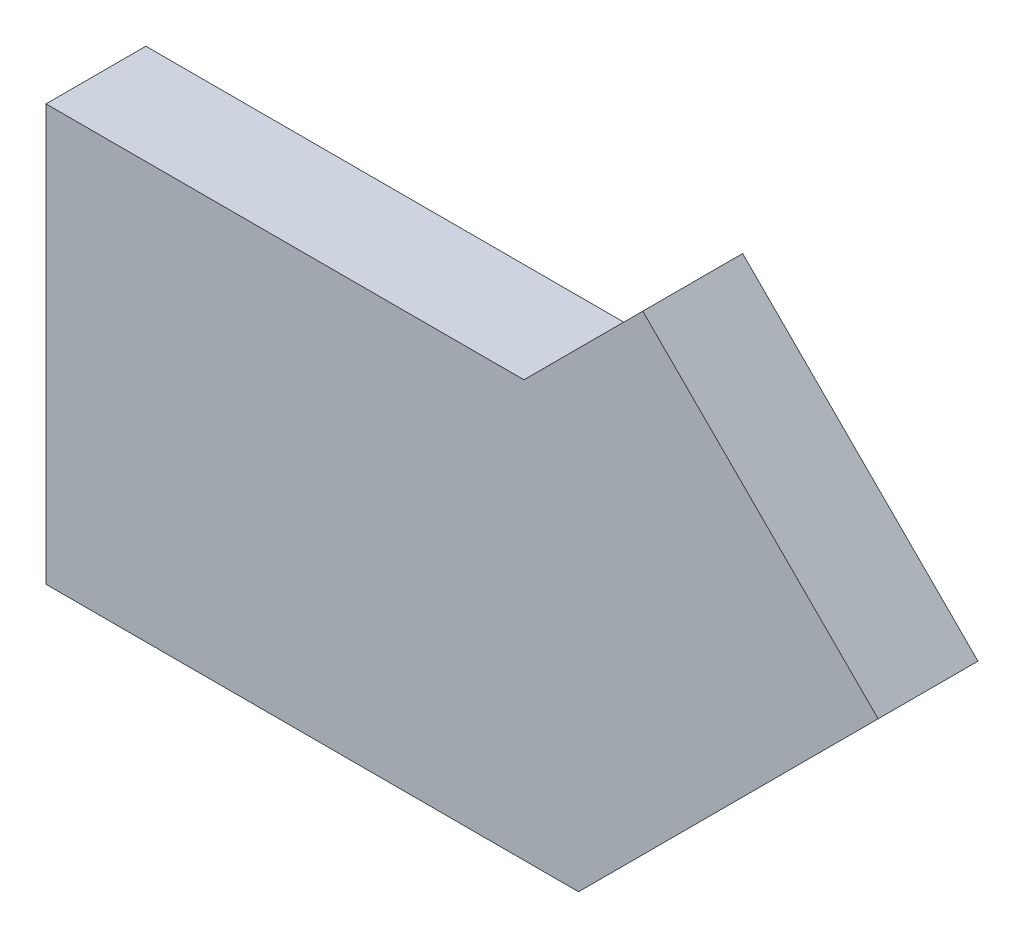
ISO-10303-21;
HEADER;
FILE_DESCRIPTION(('STEP AP214'),'2;1');
FILE_NAME('part.step','',(''),(''),'','','');
FILE_SCHEMA(('AUTOMOTIVE_DESIGN { 1 0 10303 214 1 1 1 1 }'));
ENDSEC;
DATA;
#1=APPLICATION_CONTEXT('core data for automotive mechanical design processes');
#2=APPLICATION_PROTOCOL_DEFINITION('international standard','automotive_design',2000,#1);
#3=PRODUCT_CONTEXT('',#1,'mechanical');
#4=PRODUCT('Part','Part','',(#3));
#5=PRODUCT_RELATED_PRODUCT_CATEGORY('part','',(#4));
#6=PRODUCT_DEFINITION_FORMATION('','',#4);
#7=PRODUCT_DEFINITION_CONTEXT('part definition',#1,'design');
#8=PRODUCT_DEFINITION('design','',#6,#7);
#9=PRODUCT_DEFINITION_SHAPE('','',#8);
#10=(LENGTH_UNIT() NAMED_UNIT(*) SI_UNIT(.MILLI.,.METRE.));
#11=(NAMED_UNIT(*) PLANE_ANGLE_UNIT() SI_UNIT($,.RADIAN.));
#12=(NAMED_UNIT(*) SI_UNIT($,.STERADIAN.) SOLID_ANGLE_UNIT());
#13=UNCERTAINTY_MEASURE_WITH_UNIT(LENGTH_MEASURE(1.E-05),#10,'distance_accuracy_value','');
#14=(GEOMETRIC_REPRESENTATION_CONTEXT(3) GLOBAL_UNCERTAINTY_ASSIGNED_CONTEXT((#13)) GLOBAL_UNIT_ASSIGNED_CONTEXT((#10,
#11,#12)) REPRESENTATION_CONTEXT('',''));
#15=CARTESIAN_POINT('',(0.,0.,0.));
#16=DIRECTION('',(0.,0.,1.));
#17=DIRECTION('',(1.,0.,0.));
#18=AXIS2_PLACEMENT_3D('',#15,#16,#17);
#19=CARTESIAN_POINT('',(0.,25.,6.));
#20=DIRECTION('',(1.,0.,0.));
#21=DIRECTION('',(0.,0.,-1.));
#22=AXIS2_PLACEMENT_3D('',#19,#20,#21);
#23=PLANE('',#22);
#24=DIRECTION('',(0.,-1.,0.));
#25=VECTOR('',#24,1.);
#26=CARTESIAN_POINT('',(0.,25.,0.));
#27=LINE('',#26,#25);
#28=CARTESIAN_POINT('',(0.,25.,0.));
#29=VERTEX_POINT('',#28);
#30=CARTESIAN_POINT('',(0.,0.,0.));
#31=VERTEX_POINT('',#30);
#32=EDGE_CURVE('E116',#29,#31,#27,.T.);
#33=ORIENTED_EDGE('',*,*,#32,.T.);
#34=DIRECTION('',(0.,0.,-1.));
#35=VECTOR('',#34,1.);
#36=CARTESIAN_POINT('',(0.,0.,6.));
#37=LINE('',#36,#35);
#38=CARTESIAN_POINT('',(0.,0.,6.));
#39=VERTEX_POINT('',#38);
#40=EDGE_CURVE('E11',#39,#31,#37,.T.);
#41=ORIENTED_EDGE('',*,*,#40,.F.);
#42=DIRECTION('',(0.,-1.,0.));
#43=VECTOR('',#42,1.);
#44=CARTESIAN_POINT('',(0.,25.,6.));
#45=LINE('',#44,#43);
#46=CARTESIAN_POINT('',(0.,25.,6.));
#47=VERTEX_POINT('',#46);
#48=EDGE_CURVE('E126',#47,#39,#45,.T.);
#49=ORIENTED_EDGE('',*,*,#48,.F.);
#50=DIRECTION('',(0.,0.,-1.));
#51=VECTOR('',#50,1.);
#52=CARTESIAN_POINT('',(0.,25.,6.));
#53=LINE('',#52,#51);
#54=EDGE_CURVE('E112',#47,#29,#53,.T.);
#55=ORIENTED_EDGE('',*,*,#54,.T.);
#56=EDGE_LOOP('',(#33,#41,#49,#55));
#57=FACE_BOUND('',#56,.T.);
#58=ADVANCED_FACE('F32',(#57),#23,.F.);
#59=CARTESIAN_POINT('',(0.,0.,6.));
#60=DIRECTION('',(0.,1.,0.));
#61=DIRECTION('',(0.,0.,1.));
#62=AXIS2_PLACEMENT_3D('',#59,#60,#61);
#63=PLANE('',#62);
#64=DIRECTION('',(1.,0.,0.));
#65=VECTOR('',#64,1.);
#66=CARTESIAN_POINT('',(0.,0.,0.));
#67=LINE('',#66,#65);
#68=CARTESIAN_POINT('',(32.,0.,0.));
#69=VERTEX_POINT('',#68);
#70=EDGE_CURVE('E119',#31,#69,#67,.T.);
#71=ORIENTED_EDGE('',*,*,#70,.T.);
#72=DIRECTION('',(0.,0.,-1.));
#73=VECTOR('',#72,1.);
#74=CARTESIAN_POINT('',(32.,0.,6.));
#75=LINE('',#74,#73);
#76=CARTESIAN_POINT('',(32.,0.,6.));
#77=VERTEX_POINT('',#76);
#78=EDGE_CURVE('E40',#77,#69,#75,.T.);
#79=ORIENTED_EDGE('',*,*,#78,.F.);
#80=DIRECTION('',(1.,0.,0.));
#81=VECTOR('',#80,1.);
#82=CARTESIAN_POINT('',(0.,0.,6.));
#83=LINE('',#82,#81);
#84=EDGE_CURVE('E85',#39,#77,#83,.T.);
#85=ORIENTED_EDGE('',*,*,#84,.F.);
#86=ORIENTED_EDGE('',*,*,#40,.T.);
#87=EDGE_LOOP('',(#71,#79,#85,#86));
#88=FACE_BOUND('',#87,.T.);
#89=ADVANCED_FACE('F150',(#88),#63,.F.);
#90=CARTESIAN_POINT('',(32.,0.,6.));
#91=DIRECTION('',(-0.707106781186553,0.707106781186542,0.));
#92=DIRECTION('',(-0.707106781186542,-0.707106781186553,0.));
#93=AXIS2_PLACEMENT_3D('',#90,#91,#92);
#94=PLANE('',#93);
#95=DIRECTION('',(0.707106781186542,0.707106781186553,0.));
#96=VECTOR('',#95,1.);
#97=CARTESIAN_POINT('',(32.,0.,0.));
#98=LINE('',#97,#96);
#99=CARTESIAN_POINT('',(50.,18.0000000000003,0.));
#100=VERTEX_POINT('',#99);
#101=EDGE_CURVE('E121',#69,#100,#98,.T.);
#102=ORIENTED_EDGE('',*,*,#101,.T.);
#103=DIRECTION('',(0.,0.,-1.));
#104=VECTOR('',#103,1.);
#105=CARTESIAN_POINT('',(50.,18.0000000000003,6.));
#106=LINE('',#105,#104);
#107=CARTESIAN_POINT('',(50.,18.0000000000003,6.));
#108=VERTEX_POINT('',#107);
#109=EDGE_CURVE('E107',#108,#100,#106,.T.);
#110=ORIENTED_EDGE('',*,*,#109,.F.);
#111=DIRECTION('',(0.707106781186542,0.707106781186553,0.));
#112=VECTOR('',#111,1.);
#113=CARTESIAN_POINT('',(32.,0.,6.));
#114=LINE('',#113,#112);
#115=EDGE_CURVE('E98',#77,#108,#114,.T.);
#116=ORIENTED_EDGE('',*,*,#115,.F.);
#117=ORIENTED_EDGE('',*,*,#78,.T.);
#118=EDGE_LOOP('',(#102,#110,#116,#117));
#119=FACE_BOUND('',#118,.T.);
#120=ADVANCED_FACE('F132',(#119),#94,.F.);
#121=CARTESIAN_POINT('',(50.,18.0000000000003,6.));
#122=DIRECTION('',(-0.707106781186542,-0.707106781186553,0.));
#123=DIRECTION('',(0.707106781186553,-0.707106781186542,0.));
#124=AXIS2_PLACEMENT_3D('',#121,#122,#123);
#125=PLANE('',#124);
#126=DIRECTION('',(-0.707106781186553,0.707106781186542,0.));
#127=VECTOR('',#126,1.);
#128=CARTESIAN_POINT('',(50.,18.0000000000003,0.));
#129=LINE('',#128,#127);
#130=CARTESIAN_POINT('',(35.8578643762689,32.1421356237311,0.));
#131=VERTEX_POINT('',#130);
#132=EDGE_CURVE('E106',#100,#131,#129,.T.);
#133=ORIENTED_EDGE('',*,*,#132,.T.);
#134=DIRECTION('',(0.,0.,-1.));
#135=VECTOR('',#134,1.);
#136=CARTESIAN_POINT('',(35.8578643762689,32.1421356237311,6.));
#137=LINE('',#136,#135);
#138=CARTESIAN_POINT('',(35.8578643762689,32.1421356237311,6.));
#139=VERTEX_POINT('',#138);
#140=EDGE_CURVE('E103',#139,#131,#137,.T.);
#141=ORIENTED_EDGE('',*,*,#140,.F.);
#142=DIRECTION('',(-0.707106781186553,0.707106781186542,0.));
#143=VECTOR('',#142,1.);
#144=CARTESIAN_POINT('',(50.,18.0000000000003,6.));
#145=LINE('',#144,#143);
#146=EDGE_CURVE('E92',#108,#139,#145,.T.);
#147=ORIENTED_EDGE('',*,*,#146,.F.);
#148=ORIENTED_EDGE('',*,*,#109,.T.);
#149=EDGE_LOOP('',(#133,#141,#147,#148));
#150=FACE_BOUND('',#149,.T.);
#151=ADVANCED_FACE('F104',(#150),#125,.F.);
#152=CARTESIAN_POINT('',(35.8578643762689,32.1421356237311,6.));
#153=DIRECTION('',(0.707106781186553,-0.707106781186542,0.));
#154=DIRECTION('',(0.707106781186542,0.707106781186553,0.));
#155=AXIS2_PLACEMENT_3D('',#152,#153,#154);
#156=PLANE('',#155);
#157=DIRECTION('',(-0.707106781186542,-0.707106781186553,0.));
#158=VECTOR('',#157,1.);
#159=CARTESIAN_POINT('',(35.8578643762689,32.1421356237311,0.));
#160=LINE('',#159,#158);
#161=CARTESIAN_POINT('',(28.715728752538,25.,0.));
#162=VERTEX_POINT('',#161);
#163=EDGE_CURVE('E71',#131,#162,#160,.T.);
#164=ORIENTED_EDGE('',*,*,#163,.T.);
#165=DIRECTION('',(0.,0.,-1.));
#166=VECTOR('',#165,1.);
#167=CARTESIAN_POINT('',(28.715728752538,25.,6.));
#168=LINE('',#167,#166);
#169=CARTESIAN_POINT('',(28.715728752538,25.,6.));
#170=VERTEX_POINT('',#169);
#171=EDGE_CURVE('E108',#170,#162,#168,.T.);
#172=ORIENTED_EDGE('',*,*,#171,.F.);
#173=DIRECTION('',(-0.707106781186542,-0.707106781186553,0.));
#174=VECTOR('',#173,1.);
#175=CARTESIAN_POINT('',(35.8578643762689,32.1421356237311,6.));
#176=LINE('',#175,#174);
#177=EDGE_CURVE('E96',#139,#170,#176,.T.);
#178=ORIENTED_EDGE('',*,*,#177,.F.);
#179=ORIENTED_EDGE('',*,*,#140,.T.);
#180=EDGE_LOOP('',(#164,#172,#178,#179));
#181=FACE_BOUND('',#180,.T.);
#182=ADVANCED_FACE('F110',(#181),#156,.F.);
#183=CARTESIAN_POINT('',(28.715728752538,25.,6.));
#184=DIRECTION('',(0.,-1.,0.));
#185=DIRECTION('',(1.,0.,0.));
#186=AXIS2_PLACEMENT_3D('',#183,#184,#185);
#187=PLANE('',#186);
#188=DIRECTION('',(-1.,0.,0.));
#189=VECTOR('',#188,1.);
#190=CARTESIAN_POINT('',(28.715728752538,25.,0.));
#191=LINE('',#190,#189);
#192=EDGE_CURVE('E77',#162,#29,#191,.T.);
#193=ORIENTED_EDGE('',*,*,#192,.T.);
#194=ORIENTED_EDGE('',*,*,#54,.F.);
#195=DIRECTION('',(-1.,0.,0.));
#196=VECTOR('',#195,1.);
#197=CARTESIAN_POINT('',(28.715728752538,25.,6.));
#198=LINE('',#197,#196);
#199=EDGE_CURVE('E48',#170,#47,#198,.T.);
#200=ORIENTED_EDGE('',*,*,#199,.F.);
#201=ORIENTED_EDGE('',*,*,#171,.T.);
#202=EDGE_LOOP('',(#193,#194,#200,#201));
#203=FACE_BOUND('',#202,.T.);
#204=ADVANCED_FACE('F139',(#203),#187,.F.);
#205=CARTESIAN_POINT('',(0.,0.,6.));
#206=DIRECTION('',(0.,0.,1.));
#207=DIRECTION('',(1.,0.,0.));
#208=AXIS2_PLACEMENT_3D('',#205,#206,#207);
#209=PLANE('',#208);
#210=ORIENTED_EDGE('',*,*,#48,.T.);
#211=ORIENTED_EDGE('',*,*,#84,.T.);
#212=ORIENTED_EDGE('',*,*,#115,.T.);
#213=ORIENTED_EDGE('',*,*,#146,.T.);
#214=ORIENTED_EDGE('',*,*,#177,.T.);
#215=ORIENTED_EDGE('',*,*,#199,.T.);
#216=EDGE_LOOP('',(#210,#211,#212,#213,#214,#215));
#217=FACE_BOUND('',#216,.T.);
#218=ADVANCED_FACE('F94',(#217),#209,.T.);
#219=CARTESIAN_POINT('',(0.,0.,0.));
#220=DIRECTION('',(0.,0.,1.));
#221=DIRECTION('',(1.,0.,0.));
#222=AXIS2_PLACEMENT_3D('',#219,#220,#221);
#223=PLANE('',#222);
#224=ORIENTED_EDGE('',*,*,#32,.F.);
#225=ORIENTED_EDGE('',*,*,#192,.F.);
#226=ORIENTED_EDGE('',*,*,#163,.F.);
#227=ORIENTED_EDGE('',*,*,#132,.F.);
#228=ORIENTED_EDGE('',*,*,#101,.F.);
#229=ORIENTED_EDGE('',*,*,#70,.F.);
#230=EDGE_LOOP('',(#224,#225,#226,#227,#228,#229));
#231=FACE_BOUND('',#230,.T.);
#232=ADVANCED_FACE('F135',(#231),#223,.F.);
#233=CLOSED_SHELL('',(#58,#89,#120,#151,#182,#204,#218,#232));
#234=MANIFOLD_SOLID_BREP('B2',#233);
#235=ADVANCED_BREP_SHAPE_REPRESENTATION('',(#18,#234),#14);
#236=SHAPE_DEFINITION_REPRESENTATION(#9,#235);
ENDSEC;
END-ISO-10303-21;
